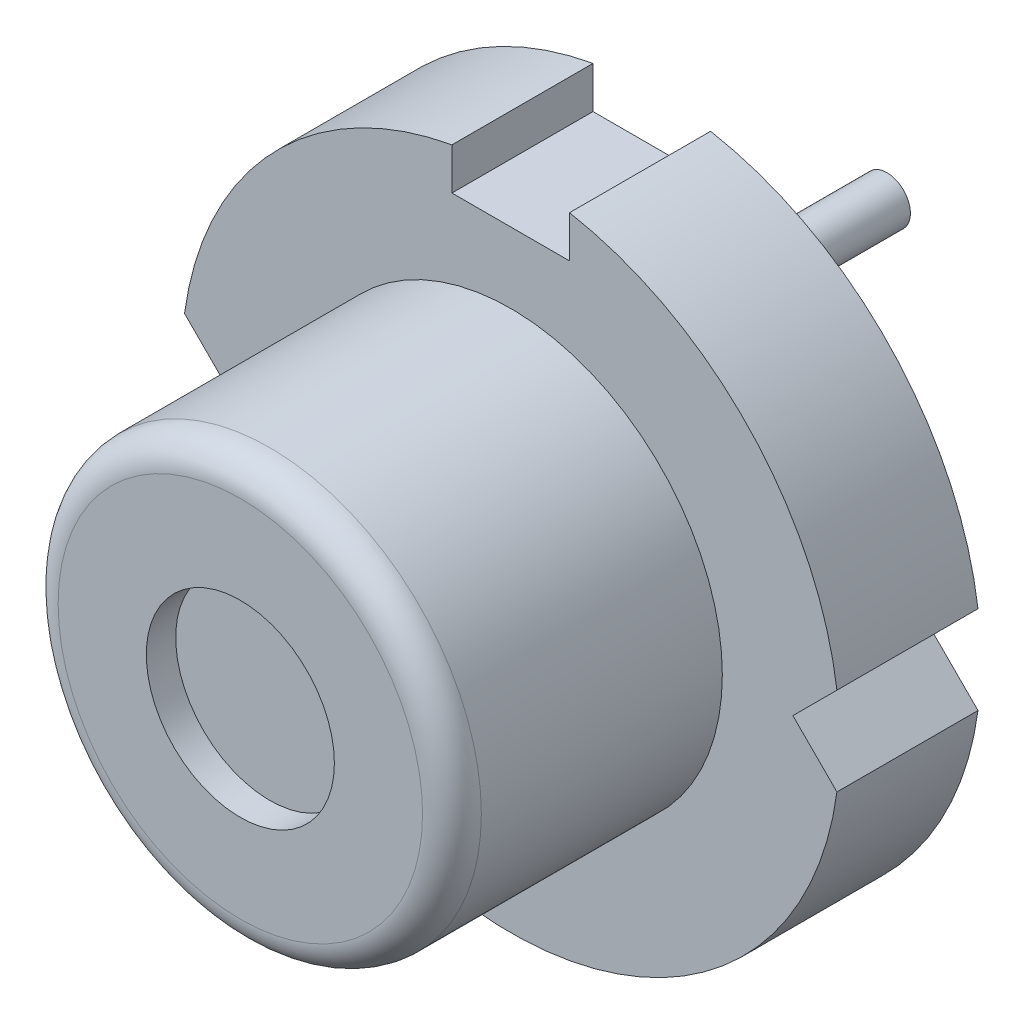
ISO-10303-21;
HEADER;
FILE_DESCRIPTION(('STEP AP214'),'2;1');
FILE_NAME('part.step','',(''),(''),'','','');
FILE_SCHEMA(('AUTOMOTIVE_DESIGN { 1 0 10303 214 1 1 1 1 }'));
ENDSEC;
DATA;
#1=APPLICATION_CONTEXT('core data for automotive mechanical design processes');
#2=APPLICATION_PROTOCOL_DEFINITION('international standard','automotive_design',2000,#1);
#3=PRODUCT_CONTEXT('',#1,'mechanical');
#4=PRODUCT('Part','Part','',(#3));
#5=PRODUCT_RELATED_PRODUCT_CATEGORY('part','',(#4));
#6=PRODUCT_DEFINITION_FORMATION('','',#4);
#7=PRODUCT_DEFINITION_CONTEXT('part definition',#1,'design');
#8=PRODUCT_DEFINITION('design','',#6,#7);
#9=PRODUCT_DEFINITION_SHAPE('','',#8);
#10=(LENGTH_UNIT() NAMED_UNIT(*) SI_UNIT(.MILLI.,.METRE.));
#11=(NAMED_UNIT(*) PLANE_ANGLE_UNIT() SI_UNIT($,.RADIAN.));
#12=(NAMED_UNIT(*) SI_UNIT($,.STERADIAN.) SOLID_ANGLE_UNIT());
#13=UNCERTAINTY_MEASURE_WITH_UNIT(LENGTH_MEASURE(1.E-05),#10,'distance_accuracy_value','');
#14=(GEOMETRIC_REPRESENTATION_CONTEXT(3) GLOBAL_UNCERTAINTY_ASSIGNED_CONTEXT((#13)) GLOBAL_UNIT_ASSIGNED_CONTEXT((#10,
#11,#12)) REPRESENTATION_CONTEXT('',''));
#15=CARTESIAN_POINT('',(0.,0.,0.));
#16=DIRECTION('',(0.,0.,1.));
#17=DIRECTION('',(1.,0.,0.));
#18=AXIS2_PLACEMENT_3D('',#15,#16,#17);
#19=CARTESIAN_POINT('',(0.,1.,0.25));
#20=DIRECTION('',(0.,0.,-1.));
#21=DIRECTION('',(-1.,0.,0.));
#22=AXIS2_PLACEMENT_3D('',#19,#20,#21);
#23=CYLINDRICAL_SURFACE('',#22,0.2);
#24=CARTESIAN_POINT('',(0.,1.,0.25));
#25=DIRECTION('',(0.,0.,-1.));
#26=DIRECTION('',(-1.,0.,0.));
#27=AXIS2_PLACEMENT_3D('',#24,#25,#26);
#28=CIRCLE('',#27,0.2);
#29=CARTESIAN_POINT('',(-0.2,1.,0.25));
#30=VERTEX_POINT('',#29);
#31=EDGE_CURVE('E11',#30,#30,#28,.T.);
#32=ORIENTED_EDGE('',*,*,#31,.T.);
#33=EDGE_LOOP('',(#32));
#34=FACE_BOUND('',#33,.T.);
#35=CARTESIAN_POINT('',(0.,1.,-2.));
#36=DIRECTION('',(0.,0.,-1.));
#37=DIRECTION('',(-1.,0.,0.));
#38=AXIS2_PLACEMENT_3D('',#35,#36,#37);
#39=CIRCLE('',#38,0.2);
#40=CARTESIAN_POINT('',(-0.2,1.,-2.));
#41=VERTEX_POINT('',#40);
#42=EDGE_CURVE('E47',#41,#41,#39,.T.);
#43=ORIENTED_EDGE('',*,*,#42,.F.);
#44=EDGE_LOOP('',(#43));
#45=FACE_BOUND('',#44,.T.);
#46=ADVANCED_FACE('F41',(#34,#45),#23,.T.);
#47=CARTESIAN_POINT('',(0.2,1.,0.25));
#48=DIRECTION('',(0.,0.,1.));
#49=DIRECTION('',(1.,0.,0.));
#50=AXIS2_PLACEMENT_3D('',#47,#48,#49);
#51=PLANE('',#50);
#52=ORIENTED_EDGE('',*,*,#31,.F.);
#53=EDGE_LOOP('',(#52));
#54=FACE_BOUND('',#53,.T.);
#55=ADVANCED_FACE('F56',(#54),#51,.T.);
#56=CARTESIAN_POINT('',(0.,1.,-2.));
#57=DIRECTION('',(0.,0.,-1.));
#58=DIRECTION('',(-1.,0.,0.));
#59=AXIS2_PLACEMENT_3D('',#56,#57,#58);
#60=PLANE('',#59);
#61=ORIENTED_EDGE('',*,*,#42,.T.);
#62=EDGE_LOOP('',(#61));
#63=FACE_BOUND('',#62,.T.);
#64=ADVANCED_FACE('F53',(#63),#60,.T.);
#65=CLOSED_SHELL('',(#46,#55,#64));
#66=MANIFOLD_SOLID_BREP('B2',#65);
#67=CARTESIAN_POINT('',(0.,-1.,0.25));
#68=DIRECTION('',(0.,0.,-1.));
#69=DIRECTION('',(-1.,0.,0.));
#70=AXIS2_PLACEMENT_3D('',#67,#68,#69);
#71=CYLINDRICAL_SURFACE('',#70,0.2);
#72=CARTESIAN_POINT('',(0.,-1.,0.25));
#73=DIRECTION('',(0.,0.,-1.));
#74=DIRECTION('',(-1.,0.,0.));
#75=AXIS2_PLACEMENT_3D('',#72,#73,#74);
#76=CIRCLE('',#75,0.2);
#77=CARTESIAN_POINT('',(-0.2,-1.,0.25));
#78=VERTEX_POINT('',#77);
#79=EDGE_CURVE('E40',#78,#78,#76,.T.);
#80=ORIENTED_EDGE('',*,*,#79,.T.);
#81=EDGE_LOOP('',(#80));
#82=FACE_BOUND('',#81,.T.);
#83=CARTESIAN_POINT('',(0.,-1.,-2.));
#84=DIRECTION('',(0.,0.,-1.));
#85=DIRECTION('',(-1.,0.,0.));
#86=AXIS2_PLACEMENT_3D('',#83,#84,#85);
#87=CIRCLE('',#86,0.2);
#88=CARTESIAN_POINT('',(-0.2,-1.,-2.));
#89=VERTEX_POINT('',#88);
#90=EDGE_CURVE('E96',#89,#89,#87,.T.);
#91=ORIENTED_EDGE('',*,*,#90,.F.);
#92=EDGE_LOOP('',(#91));
#93=FACE_BOUND('',#92,.T.);
#94=ADVANCED_FACE('F90',(#82,#93),#71,.T.);
#95=CARTESIAN_POINT('',(0.2,-1.,0.25));
#96=DIRECTION('',(0.,0.,1.));
#97=DIRECTION('',(1.,0.,0.));
#98=AXIS2_PLACEMENT_3D('',#95,#96,#97);
#99=PLANE('',#98);
#100=ORIENTED_EDGE('',*,*,#79,.F.);
#101=EDGE_LOOP('',(#100));
#102=FACE_BOUND('',#101,.T.);
#103=ADVANCED_FACE('F105',(#102),#99,.T.);
#104=CARTESIAN_POINT('',(0.,-1.,-2.));
#105=DIRECTION('',(0.,0.,-1.));
#106=DIRECTION('',(-1.,0.,0.));
#107=AXIS2_PLACEMENT_3D('',#104,#105,#106);
#108=PLANE('',#107);
#109=ORIENTED_EDGE('',*,*,#90,.T.);
#110=EDGE_LOOP('',(#109));
#111=FACE_BOUND('',#110,.T.);
#112=ADVANCED_FACE('F102',(#111),#108,.T.);
#113=CLOSED_SHELL('',(#94,#103,#112));
#114=MANIFOLD_SOLID_BREP('B6',#113);
#115=CARTESIAN_POINT('',(0.,0.,0.));
#116=DIRECTION('',(0.,0.,1.));
#117=DIRECTION('',(1.,0.,0.));
#118=AXIS2_PLACEMENT_3D('',#115,#116,#117);
#119=CYLINDRICAL_SURFACE('',#118,2.8);
#120=DIRECTION('',(0.,0.,1.));
#121=VECTOR('',#120,1.);
#122=CARTESIAN_POINT('',(0.5,2.75499546279118,0.));
#123=LINE('',#122,#121);
#124=CARTESIAN_POINT('',(0.5,2.75499546279118,0.));
#125=VERTEX_POINT('',#124);
#126=CARTESIAN_POINT('',(0.5,2.75499546279118,1.2));
#127=VERTEX_POINT('',#126);
#128=EDGE_CURVE('E318',#125,#127,#123,.T.);
#129=ORIENTED_EDGE('',*,*,#128,.T.);
#130=CARTESIAN_POINT('',(0.,0.,1.2));
#131=DIRECTION('',(0.,0.,1.));
#132=DIRECTION('',(1.,0.,0.));
#133=AXIS2_PLACEMENT_3D('',#130,#131,#132);
#134=CIRCLE('',#133,2.8);
#135=CARTESIAN_POINT('',(2.77480157480236,0.374801574802366,1.2));
#136=VERTEX_POINT('',#135);
#137=EDGE_CURVE('E237',#136,#127,#134,.T.);
#138=ORIENTED_EDGE('',*,*,#137,.F.);
#139=DIRECTION('',(0.,0.,1.));
#140=VECTOR('',#139,1.);
#141=CARTESIAN_POINT('',(2.77480157480236,0.374801574802366,0.));
#142=LINE('',#141,#140);
#143=CARTESIAN_POINT('',(2.77480157480236,0.374801574802366,0.));
#144=VERTEX_POINT('',#143);
#145=EDGE_CURVE('E291',#144,#136,#142,.T.);
#146=ORIENTED_EDGE('',*,*,#145,.F.);
#147=CARTESIAN_POINT('',(0.,0.,0.));
#148=DIRECTION('',(0.,0.,1.));
#149=DIRECTION('',(1.,0.,0.));
#150=AXIS2_PLACEMENT_3D('',#147,#148,#149);
#151=CIRCLE('',#150,2.8);
#152=EDGE_CURVE('E232',#144,#125,#151,.T.);
#153=ORIENTED_EDGE('',*,*,#152,.T.);
#154=EDGE_LOOP('',(#129,#138,#146,#153));
#155=FACE_BOUND('',#154,.T.);
#156=ADVANCED_FACE('F130',(#155),#119,.T.);
#157=DIRECTION('',(0.,0.,1.));
#158=VECTOR('',#157,1.);
#159=CARTESIAN_POINT('',(-0.5,2.75499546279118,0.));
#160=LINE('',#159,#158);
#161=CARTESIAN_POINT('',(-0.5,2.75499546279118,0.));
#162=VERTEX_POINT('',#161);
#163=CARTESIAN_POINT('',(-0.5,2.75499546279118,1.2));
#164=VERTEX_POINT('',#163);
#165=EDGE_CURVE('E145',#162,#164,#160,.T.);
#166=ORIENTED_EDGE('',*,*,#165,.F.);
#167=CARTESIAN_POINT('',(-2.77480157480236,0.374801574802365,0.));
#168=VERTEX_POINT('',#167);
#169=EDGE_CURVE('E221',#162,#168,#151,.T.);
#170=ORIENTED_EDGE('',*,*,#169,.T.);
#171=DIRECTION('',(0.,0.,1.));
#172=VECTOR('',#171,1.);
#173=CARTESIAN_POINT('',(-2.77480157480236,0.374801574802365,0.));
#174=LINE('',#173,#172);
#175=CARTESIAN_POINT('',(-2.77480157480236,0.374801574802365,1.2));
#176=VERTEX_POINT('',#175);
#177=EDGE_CURVE('E300',#168,#176,#174,.T.);
#178=ORIENTED_EDGE('',*,*,#177,.T.);
#179=EDGE_CURVE('E223',#164,#176,#134,.T.);
#180=ORIENTED_EDGE('',*,*,#179,.F.);
#181=EDGE_LOOP('',(#166,#170,#178,#180));
#182=FACE_BOUND('',#181,.T.);
#183=ADVANCED_FACE('F219',(#182),#119,.T.);
#184=DIRECTION('',(0.,0.,1.));
#185=VECTOR('',#184,1.);
#186=CARTESIAN_POINT('',(-2.77480157480236,-0.374801574802365,0.));
#187=LINE('',#186,#185);
#188=CARTESIAN_POINT('',(-2.77480157480236,-0.374801574802365,0.));
#189=VERTEX_POINT('',#188);
#190=CARTESIAN_POINT('',(-2.77480157480236,-0.374801574802365,1.2));
#191=VERTEX_POINT('',#190);
#192=EDGE_CURVE('E153',#189,#191,#187,.T.);
#193=ORIENTED_EDGE('',*,*,#192,.F.);
#194=CARTESIAN_POINT('',(2.77480157480236,-0.374801574802364,0.));
#195=VERTEX_POINT('',#194);
#196=EDGE_CURVE('E233',#189,#195,#151,.T.);
#197=ORIENTED_EDGE('',*,*,#196,.T.);
#198=DIRECTION('',(0.,0.,1.));
#199=VECTOR('',#198,1.);
#200=CARTESIAN_POINT('',(2.77480157480236,-0.374801574802364,0.));
#201=LINE('',#200,#199);
#202=CARTESIAN_POINT('',(2.77480157480236,-0.374801574802364,1.2));
#203=VERTEX_POINT('',#202);
#204=EDGE_CURVE('E303',#195,#203,#201,.T.);
#205=ORIENTED_EDGE('',*,*,#204,.T.);
#206=EDGE_CURVE('E280',#191,#203,#134,.T.);
#207=ORIENTED_EDGE('',*,*,#206,.F.);
#208=EDGE_LOOP('',(#193,#197,#205,#207));
#209=FACE_BOUND('',#208,.T.);
#210=ADVANCED_FACE('F263',(#209),#119,.T.);
#211=CARTESIAN_POINT('',(2.8,0.,0.));
#212=DIRECTION('',(0.,0.,-1.));
#213=DIRECTION('',(-1.,0.,0.));
#214=AXIS2_PLACEMENT_3D('',#211,#212,#213);
#215=PLANE('',#214);
#216=CARTESIAN_POINT('',(-1.,0.,0.));
#217=DIRECTION('',(0.,0.,-1.));
#218=DIRECTION('',(-1.,0.,0.));
#219=AXIS2_PLACEMENT_3D('',#216,#217,#218);
#220=CIRCLE('',#219,0.2);
#221=CARTESIAN_POINT('',(-1.2,0.,0.));
#222=VERTEX_POINT('',#221);
#223=EDGE_CURVE('E243',#222,#222,#220,.T.);
#224=ORIENTED_EDGE('',*,*,#223,.F.);
#225=EDGE_LOOP('',(#224));
#226=FACE_BOUND('',#225,.T.);
#227=CARTESIAN_POINT('',(0.,-1.,0.));
#228=DIRECTION('',(0.,0.,-1.));
#229=DIRECTION('',(-1.,0.,0.));
#230=AXIS2_PLACEMENT_3D('',#227,#228,#229);
#231=CIRCLE('',#230,0.449999999999987);
#232=CARTESIAN_POINT('',(-0.449999999999987,-1.,0.));
#233=VERTEX_POINT('',#232);
#234=EDGE_CURVE('E354',#233,#233,#231,.T.);
#235=ORIENTED_EDGE('',*,*,#234,.F.);
#236=EDGE_LOOP('',(#235));
#237=FACE_BOUND('',#236,.T.);
#238=CARTESIAN_POINT('',(0.,1.,0.));
#239=DIRECTION('',(0.,0.,-1.));
#240=DIRECTION('',(-1.,0.,0.));
#241=AXIS2_PLACEMENT_3D('',#238,#239,#240);
#242=CIRCLE('',#241,0.449999999999987);
#243=CARTESIAN_POINT('',(-0.449999999999987,1.,0.));
#244=VERTEX_POINT('',#243);
#245=EDGE_CURVE('E344',#244,#244,#242,.T.);
#246=ORIENTED_EDGE('',*,*,#245,.F.);
#247=EDGE_LOOP('',(#246));
#248=FACE_BOUND('',#247,.T.);
#249=DIRECTION('',(0.,1.,0.));
#250=VECTOR('',#249,1.);
#251=CARTESIAN_POINT('',(0.5,2.4,0.));
#252=LINE('',#251,#250);
#253=CARTESIAN_POINT('',(0.5,2.4,0.));
#254=VERTEX_POINT('',#253);
#255=EDGE_CURVE('E224',#254,#125,#252,.T.);
#256=ORIENTED_EDGE('',*,*,#255,.T.);
#257=ORIENTED_EDGE('',*,*,#152,.F.);
#258=DIRECTION('',(-0.707106781186544,-0.707106781186551,0.));
#259=VECTOR('',#258,1.);
#260=CARTESIAN_POINT('',(2.77480157480236,0.374801574802366,0.));
#261=LINE('',#260,#259);
#262=CARTESIAN_POINT('',(2.4,0.,0.));
#263=VERTEX_POINT('',#262);
#264=EDGE_CURVE('E289',#144,#263,#261,.T.);
#265=ORIENTED_EDGE('',*,*,#264,.T.);
#266=DIRECTION('',(0.707106781186546,-0.707106781186549,0.));
#267=VECTOR('',#266,1.);
#268=CARTESIAN_POINT('',(2.4,0.,0.));
#269=LINE('',#268,#267);
#270=EDGE_CURVE('E287',#263,#195,#269,.T.);
#271=ORIENTED_EDGE('',*,*,#270,.T.);
#272=ORIENTED_EDGE('',*,*,#196,.F.);
#273=DIRECTION('',(0.707106781186545,0.70710678118655,0.));
#274=VECTOR('',#273,1.);
#275=CARTESIAN_POINT('',(-2.77480157480236,-0.374801574802365,0.));
#276=LINE('',#275,#274);
#277=CARTESIAN_POINT('',(-2.4,0.,0.));
#278=VERTEX_POINT('',#277);
#279=EDGE_CURVE('E284',#189,#278,#276,.T.);
#280=ORIENTED_EDGE('',*,*,#279,.T.);
#281=DIRECTION('',(-0.707106781186545,0.70710678118655,0.));
#282=VECTOR('',#281,1.);
#283=CARTESIAN_POINT('',(-2.4,0.,0.));
#284=LINE('',#283,#282);
#285=EDGE_CURVE('E231',#278,#168,#284,.T.);
#286=ORIENTED_EDGE('',*,*,#285,.T.);
#287=ORIENTED_EDGE('',*,*,#169,.F.);
#288=DIRECTION('',(0.,-1.,0.));
#289=VECTOR('',#288,1.);
#290=CARTESIAN_POINT('',(-0.5,2.75499546279118,0.));
#291=LINE('',#290,#289);
#292=CARTESIAN_POINT('',(-0.5,2.4,0.));
#293=VERTEX_POINT('',#292);
#294=EDGE_CURVE('E207',#162,#293,#291,.T.);
#295=ORIENTED_EDGE('',*,*,#294,.T.);
#296=DIRECTION('',(1.,0.,0.));
#297=VECTOR('',#296,1.);
#298=CARTESIAN_POINT('',(-0.5,2.4,0.));
#299=LINE('',#298,#297);
#300=EDGE_CURVE('E214',#293,#254,#299,.T.);
#301=ORIENTED_EDGE('',*,*,#300,.T.);
#302=EDGE_LOOP('',(#256,#257,#265,#271,#272,#280,#286,#287,#295,#301));
#303=FACE_BOUND('',#302,.T.);
#304=ADVANCED_FACE('F228',(#226,#237,#248,#303),#215,.T.);
#305=CARTESIAN_POINT('',(0.,0.,1.2));
#306=DIRECTION('',(0.,0.,1.));
#307=DIRECTION('',(1.,0.,0.));
#308=AXIS2_PLACEMENT_3D('',#305,#306,#307);
#309=PLANE('',#308);
#310=CARTESIAN_POINT('',(0.,0.,1.2));
#311=DIRECTION('',(0.,0.,1.));
#312=DIRECTION('',(1.,0.,0.));
#313=AXIS2_PLACEMENT_3D('',#310,#311,#312);
#314=CIRCLE('',#313,1.8);
#315=CARTESIAN_POINT('',(1.8,0.,1.2));
#316=VERTEX_POINT('',#315);
#317=EDGE_CURVE('E236',#316,#316,#314,.T.);
#318=ORIENTED_EDGE('',*,*,#317,.F.);
#319=EDGE_LOOP('',(#318));
#320=FACE_BOUND('',#319,.T.);
#321=DIRECTION('',(0.,1.,0.));
#322=VECTOR('',#321,1.);
#323=CARTESIAN_POINT('',(0.5,2.4,1.2));
#324=LINE('',#323,#322);
#325=CARTESIAN_POINT('',(0.5,2.4,1.2));
#326=VERTEX_POINT('',#325);
#327=EDGE_CURVE('E215',#326,#127,#324,.T.);
#328=ORIENTED_EDGE('',*,*,#327,.F.);
#329=DIRECTION('',(1.,0.,0.));
#330=VECTOR('',#329,1.);
#331=CARTESIAN_POINT('',(-0.5,2.4,1.2));
#332=LINE('',#331,#330);
#333=CARTESIAN_POINT('',(-0.5,2.4,1.2));
#334=VERTEX_POINT('',#333);
#335=EDGE_CURVE('E340',#334,#326,#332,.T.);
#336=ORIENTED_EDGE('',*,*,#335,.F.);
#337=DIRECTION('',(0.,-1.,0.));
#338=VECTOR('',#337,1.);
#339=CARTESIAN_POINT('',(-0.5,2.75499546279118,1.2));
#340=LINE('',#339,#338);
#341=EDGE_CURVE('E338',#164,#334,#340,.T.);
#342=ORIENTED_EDGE('',*,*,#341,.F.);
#343=ORIENTED_EDGE('',*,*,#179,.T.);
#344=DIRECTION('',(-0.707106781186545,0.70710678118655,0.));
#345=VECTOR('',#344,1.);
#346=CARTESIAN_POINT('',(-2.4,0.,1.2));
#347=LINE('',#346,#345);
#348=CARTESIAN_POINT('',(-2.4,0.,1.2));
#349=VERTEX_POINT('',#348);
#350=EDGE_CURVE('E323',#349,#176,#347,.T.);
#351=ORIENTED_EDGE('',*,*,#350,.F.);
#352=DIRECTION('',(0.707106781186545,0.70710678118655,0.));
#353=VECTOR('',#352,1.);
#354=CARTESIAN_POINT('',(-2.77480157480236,-0.374801574802365,1.2));
#355=LINE('',#354,#353);
#356=EDGE_CURVE('E316',#191,#349,#355,.T.);
#357=ORIENTED_EDGE('',*,*,#356,.F.);
#358=ORIENTED_EDGE('',*,*,#206,.T.);
#359=DIRECTION('',(0.707106781186546,-0.707106781186549,0.));
#360=VECTOR('',#359,1.);
#361=CARTESIAN_POINT('',(2.4,0.,1.2));
#362=LINE('',#361,#360);
#363=CARTESIAN_POINT('',(2.4,0.,1.2));
#364=VERTEX_POINT('',#363);
#365=EDGE_CURVE('E294',#364,#203,#362,.T.);
#366=ORIENTED_EDGE('',*,*,#365,.F.);
#367=DIRECTION('',(-0.707106781186544,-0.707106781186551,0.));
#368=VECTOR('',#367,1.);
#369=CARTESIAN_POINT('',(2.77480157480236,0.374801574802366,1.2));
#370=LINE('',#369,#368);
#371=EDGE_CURVE('E297',#136,#364,#370,.T.);
#372=ORIENTED_EDGE('',*,*,#371,.F.);
#373=ORIENTED_EDGE('',*,*,#137,.T.);
#374=EDGE_LOOP('',(#328,#336,#342,#343,#351,#357,#358,#366,#372,#373));
#375=FACE_BOUND('',#374,.T.);
#376=ADVANCED_FACE('F274',(#320,#375),#309,.T.);
#377=CARTESIAN_POINT('',(2.4,0.,0.));
#378=DIRECTION('',(-0.707106781186549,-0.707106781186546,0.));
#379=DIRECTION('',(0.707106781186546,-0.707106781186549,0.));
#380=AXIS2_PLACEMENT_3D('',#377,#378,#379);
#381=PLANE('',#380);
#382=ORIENTED_EDGE('',*,*,#365,.T.);
#383=ORIENTED_EDGE('',*,*,#204,.F.);
#384=ORIENTED_EDGE('',*,*,#270,.F.);
#385=DIRECTION('',(0.,0.,1.));
#386=VECTOR('',#385,1.);
#387=CARTESIAN_POINT('',(2.4,0.,0.));
#388=LINE('',#387,#386);
#389=EDGE_CURVE('E293',#263,#364,#388,.T.);
#390=ORIENTED_EDGE('',*,*,#389,.T.);
#391=EDGE_LOOP('',(#382,#383,#384,#390));
#392=FACE_BOUND('',#391,.T.);
#393=ADVANCED_FACE('F305',(#392),#381,.F.);
#394=CARTESIAN_POINT('',(2.77480157480236,0.374801574802366,0.));
#395=DIRECTION('',(-0.707106781186551,0.707106781186544,0.));
#396=DIRECTION('',(-0.707106781186544,-0.707106781186551,0.));
#397=AXIS2_PLACEMENT_3D('',#394,#395,#396);
#398=PLANE('',#397);
#399=ORIENTED_EDGE('',*,*,#371,.T.);
#400=ORIENTED_EDGE('',*,*,#389,.F.);
#401=ORIENTED_EDGE('',*,*,#264,.F.);
#402=ORIENTED_EDGE('',*,*,#145,.T.);
#403=EDGE_LOOP('',(#399,#400,#401,#402));
#404=FACE_BOUND('',#403,.T.);
#405=ADVANCED_FACE('F309',(#404),#398,.F.);
#406=CARTESIAN_POINT('',(-2.4,0.,0.));
#407=DIRECTION('',(0.70710678118655,0.707106781186545,0.));
#408=DIRECTION('',(-0.707106781186545,0.70710678118655,0.));
#409=AXIS2_PLACEMENT_3D('',#406,#407,#408);
#410=PLANE('',#409);
#411=ORIENTED_EDGE('',*,*,#350,.T.);
#412=ORIENTED_EDGE('',*,*,#177,.F.);
#413=ORIENTED_EDGE('',*,*,#285,.F.);
#414=DIRECTION('',(0.,0.,1.));
#415=VECTOR('',#414,1.);
#416=CARTESIAN_POINT('',(-2.4,0.,0.));
#417=LINE('',#416,#415);
#418=EDGE_CURVE('E281',#278,#349,#417,.T.);
#419=ORIENTED_EDGE('',*,*,#418,.T.);
#420=EDGE_LOOP('',(#411,#412,#413,#419));
#421=FACE_BOUND('',#420,.T.);
#422=ADVANCED_FACE('F336',(#421),#410,.F.);
#423=CARTESIAN_POINT('',(-2.77480157480236,-0.374801574802365,0.));
#424=DIRECTION('',(0.70710678118655,-0.707106781186545,0.));
#425=DIRECTION('',(0.707106781186545,0.70710678118655,0.));
#426=AXIS2_PLACEMENT_3D('',#423,#424,#425);
#427=PLANE('',#426);
#428=ORIENTED_EDGE('',*,*,#356,.T.);
#429=ORIENTED_EDGE('',*,*,#418,.F.);
#430=ORIENTED_EDGE('',*,*,#279,.F.);
#431=ORIENTED_EDGE('',*,*,#192,.T.);
#432=EDGE_LOOP('',(#428,#429,#430,#431));
#433=FACE_BOUND('',#432,.T.);
#434=ADVANCED_FACE('F337',(#433),#427,.F.);
#435=CARTESIAN_POINT('',(0.5,2.4,0.));
#436=DIRECTION('',(1.,0.,0.));
#437=DIRECTION('',(0.,1.,0.));
#438=AXIS2_PLACEMENT_3D('',#435,#436,#437);
#439=PLANE('',#438);
#440=ORIENTED_EDGE('',*,*,#327,.T.);
#441=ORIENTED_EDGE('',*,*,#128,.F.);
#442=ORIENTED_EDGE('',*,*,#255,.F.);
#443=DIRECTION('',(0.,0.,1.));
#444=VECTOR('',#443,1.);
#445=CARTESIAN_POINT('',(0.5,2.4,0.));
#446=LINE('',#445,#444);
#447=EDGE_CURVE('E321',#254,#326,#446,.T.);
#448=ORIENTED_EDGE('',*,*,#447,.T.);
#449=EDGE_LOOP('',(#440,#441,#442,#448));
#450=FACE_BOUND('',#449,.T.);
#451=ADVANCED_FACE('F395',(#450),#439,.F.);
#452=CARTESIAN_POINT('',(-0.5,2.4,0.));
#453=DIRECTION('',(0.,-1.,0.));
#454=DIRECTION('',(0.,0.,-1.));
#455=AXIS2_PLACEMENT_3D('',#452,#453,#454);
#456=PLANE('',#455);
#457=ORIENTED_EDGE('',*,*,#335,.T.);
#458=ORIENTED_EDGE('',*,*,#447,.F.);
#459=ORIENTED_EDGE('',*,*,#300,.F.);
#460=DIRECTION('',(0.,0.,1.));
#461=VECTOR('',#460,1.);
#462=CARTESIAN_POINT('',(-0.5,2.4,0.));
#463=LINE('',#462,#461);
#464=EDGE_CURVE('E209',#293,#334,#463,.T.);
#465=ORIENTED_EDGE('',*,*,#464,.T.);
#466=EDGE_LOOP('',(#457,#458,#459,#465));
#467=FACE_BOUND('',#466,.T.);
#468=ADVANCED_FACE('F398',(#467),#456,.F.);
#469=CARTESIAN_POINT('',(-0.5,2.75499546279118,0.));
#470=DIRECTION('',(-1.,0.,0.));
#471=DIRECTION('',(0.,-1.,0.));
#472=AXIS2_PLACEMENT_3D('',#469,#470,#471);
#473=PLANE('',#472);
#474=ORIENTED_EDGE('',*,*,#341,.T.);
#475=ORIENTED_EDGE('',*,*,#464,.F.);
#476=ORIENTED_EDGE('',*,*,#294,.F.);
#477=ORIENTED_EDGE('',*,*,#165,.T.);
#478=EDGE_LOOP('',(#474,#475,#476,#477));
#479=FACE_BOUND('',#478,.T.);
#480=ADVANCED_FACE('F208',(#479),#473,.F.);
#481=CARTESIAN_POINT('',(0.,1.,0.));
#482=DIRECTION('',(0.,0.,-1.));
#483=DIRECTION('',(-1.,0.,0.));
#484=AXIS2_PLACEMENT_3D('',#481,#482,#483);
#485=CYLINDRICAL_SURFACE('',#484,0.449999999999987);
#486=CARTESIAN_POINT('',(0.,1.,1.20000000000001));
#487=DIRECTION('',(0.,0.,-1.));
#488=DIRECTION('',(-1.,0.,0.));
#489=AXIS2_PLACEMENT_3D('',#486,#487,#488);
#490=CIRCLE('',#489,0.449999999999987);
#491=CARTESIAN_POINT('',(-0.449999999999987,1.,1.20000000000001));
#492=VERTEX_POINT('',#491);
#493=EDGE_CURVE('E341',#492,#492,#490,.T.);
#494=ORIENTED_EDGE('',*,*,#493,.F.);
#495=EDGE_LOOP('',(#494));
#496=FACE_BOUND('',#495,.T.);
#497=ORIENTED_EDGE('',*,*,#245,.T.);
#498=EDGE_LOOP('',(#497));
#499=FACE_BOUND('',#498,.T.);
#500=ADVANCED_FACE('F390',(#496,#499),#485,.F.);
#501=CARTESIAN_POINT('',(0.,-1.,0.));
#502=DIRECTION('',(0.,0.,-1.));
#503=DIRECTION('',(-1.,0.,0.));
#504=AXIS2_PLACEMENT_3D('',#501,#502,#503);
#505=CYLINDRICAL_SURFACE('',#504,0.449999999999987);
#506=CARTESIAN_POINT('',(0.,-1.,1.20000000000001));
#507=DIRECTION('',(0.,0.,-1.));
#508=DIRECTION('',(-1.,0.,0.));
#509=AXIS2_PLACEMENT_3D('',#506,#507,#508);
#510=CIRCLE('',#509,0.449999999999987);
#511=CARTESIAN_POINT('',(-0.449999999999987,-1.,1.20000000000001));
#512=VERTEX_POINT('',#511);
#513=EDGE_CURVE('E351',#512,#512,#510,.T.);
#514=ORIENTED_EDGE('',*,*,#513,.F.);
#515=EDGE_LOOP('',(#514));
#516=FACE_BOUND('',#515,.T.);
#517=ORIENTED_EDGE('',*,*,#234,.T.);
#518=EDGE_LOOP('',(#517));
#519=FACE_BOUND('',#518,.T.);
#520=ADVANCED_FACE('F387',(#516,#519),#505,.F.);
#521=CARTESIAN_POINT('',(1.8,0.,1.2));
#522=DIRECTION('',(0.,0.,-1.));
#523=DIRECTION('',(-1.,0.,0.));
#524=AXIS2_PLACEMENT_3D('',#521,#522,#523);
#525=PLANE('',#524);
#526=ORIENTED_EDGE('',*,*,#513,.T.);
#527=EDGE_LOOP('',(#526));
#528=FACE_BOUND('',#527,.T.);
#529=ADVANCED_FACE('F384',(#528),#525,.T.);
#530=ORIENTED_EDGE('',*,*,#493,.T.);
#531=EDGE_LOOP('',(#530));
#532=FACE_BOUND('',#531,.T.);
#533=ADVANCED_FACE('F378',(#532),#525,.T.);
#534=CARTESIAN_POINT('',(0.,0.,1.2));
#535=DIRECTION('',(0.,0.,1.));
#536=DIRECTION('',(1.,0.,0.));
#537=AXIS2_PLACEMENT_3D('',#534,#535,#536);
#538=CYLINDRICAL_SURFACE('',#537,1.8);
#539=CARTESIAN_POINT('',(0.,0.,3.25));
#540=DIRECTION('',(0.,0.,1.));
#541=DIRECTION('',(1.,0.,0.));
#542=AXIS2_PLACEMENT_3D('',#539,#540,#541);
#543=CIRCLE('',#542,1.8);
#544=CARTESIAN_POINT('',(1.8,0.,3.25));
#545=VERTEX_POINT('',#544);
#546=EDGE_CURVE('E88',#545,#545,#543,.F.);
#547=ORIENTED_EDGE('',*,*,#546,.T.);
#548=EDGE_LOOP('',(#547));
#549=FACE_BOUND('',#548,.T.);
#550=ORIENTED_EDGE('',*,*,#317,.T.);
#551=EDGE_LOOP('',(#550));
#552=FACE_BOUND('',#551,.T.);
#553=ADVANCED_FACE('F369',(#549,#552),#538,.T.);
#554=CARTESIAN_POINT('',(0.,0.,3.5));
#555=DIRECTION('',(0.,0.,1.));
#556=DIRECTION('',(1.,0.,0.));
#557=AXIS2_PLACEMENT_3D('',#554,#555,#556);
#558=PLANE('',#557);
#559=CARTESIAN_POINT('',(0.,0.,3.5));
#560=DIRECTION('',(0.,0.,1.));
#561=DIRECTION('',(1.,0.,0.));
#562=AXIS2_PLACEMENT_3D('',#559,#560,#561);
#563=CIRCLE('',#562,1.55);
#564=CARTESIAN_POINT('',(1.55,0.,3.5));
#565=VERTEX_POINT('',#564);
#566=EDGE_CURVE('E138',#565,#565,#563,.T.);
#567=ORIENTED_EDGE('',*,*,#566,.T.);
#568=EDGE_LOOP('',(#567));
#569=FACE_BOUND('',#568,.T.);
#570=CARTESIAN_POINT('',(0.,0.,3.5));
#571=DIRECTION('',(0.,0.,1.));
#572=DIRECTION('',(1.,0.,0.));
#573=AXIS2_PLACEMENT_3D('',#570,#571,#572);
#574=CIRCLE('',#573,0.79999999999999);
#575=CARTESIAN_POINT('',(0.79999999999999,0.,3.5));
#576=VERTEX_POINT('',#575);
#577=EDGE_CURVE('E363',#576,#576,#574,.T.);
#578=ORIENTED_EDGE('',*,*,#577,.F.);
#579=EDGE_LOOP('',(#578));
#580=FACE_BOUND('',#579,.T.);
#581=ADVANCED_FACE('F248',(#569,#580),#558,.T.);
#582=CARTESIAN_POINT('',(-1.,0.,0.));
#583=DIRECTION('',(0.,0.,-1.));
#584=DIRECTION('',(-1.,0.,0.));
#585=AXIS2_PLACEMENT_3D('',#582,#583,#584);
#586=CYLINDRICAL_SURFACE('',#585,0.2);
#587=ORIENTED_EDGE('',*,*,#223,.T.);
#588=EDGE_LOOP('',(#587));
#589=FACE_BOUND('',#588,.T.);
#590=CARTESIAN_POINT('',(-1.,0.,-2.));
#591=DIRECTION('',(0.,0.,-1.));
#592=DIRECTION('',(-1.,0.,0.));
#593=AXIS2_PLACEMENT_3D('',#590,#591,#592);
#594=CIRCLE('',#593,0.2);
#595=CARTESIAN_POINT('',(-1.2,0.,-2.));
#596=VERTEX_POINT('',#595);
#597=EDGE_CURVE('E357',#596,#596,#594,.T.);
#598=ORIENTED_EDGE('',*,*,#597,.F.);
#599=EDGE_LOOP('',(#598));
#600=FACE_BOUND('',#599,.T.);
#601=ADVANCED_FACE('F368',(#589,#600),#586,.T.);
#602=CARTESIAN_POINT('',(-1.,0.,-2.));
#603=DIRECTION('',(0.,0.,-1.));
#604=DIRECTION('',(-1.,0.,0.));
#605=AXIS2_PLACEMENT_3D('',#602,#603,#604);
#606=PLANE('',#605);
#607=ORIENTED_EDGE('',*,*,#597,.T.);
#608=EDGE_LOOP('',(#607));
#609=FACE_BOUND('',#608,.T.);
#610=ADVANCED_FACE('F375',(#609),#606,.T.);
#611=CARTESIAN_POINT('',(0.,0.,3.25));
#612=DIRECTION('',(0.,0.,-1.));
#613=DIRECTION('',(-1.,0.,0.));
#614=AXIS2_PLACEMENT_3D('',#611,#612,#613);
#615=PLANE('',#614);
#616=CARTESIAN_POINT('',(0.,0.,3.25));
#617=DIRECTION('',(0.,0.,1.));
#618=DIRECTION('',(1.,0.,0.));
#619=AXIS2_PLACEMENT_3D('',#616,#617,#618);
#620=CIRCLE('',#619,0.79999999999999);
#621=CARTESIAN_POINT('',(0.79999999999999,0.,3.25));
#622=VERTEX_POINT('',#621);
#623=EDGE_CURVE('E360',#622,#622,#620,.T.);
#624=ORIENTED_EDGE('',*,*,#623,.T.);
#625=EDGE_LOOP('',(#624));
#626=FACE_BOUND('',#625,.T.);
#627=ADVANCED_FACE('F257',(#626),#615,.F.);
#628=CARTESIAN_POINT('',(0.,0.,3.5));
#629=DIRECTION('',(0.,0.,1.));
#630=DIRECTION('',(1.,0.,0.));
#631=AXIS2_PLACEMENT_3D('',#628,#629,#630);
#632=CYLINDRICAL_SURFACE('',#631,0.79999999999999);
#633=ORIENTED_EDGE('',*,*,#623,.F.);
#634=EDGE_LOOP('',(#633));
#635=FACE_BOUND('',#634,.T.);
#636=ORIENTED_EDGE('',*,*,#577,.T.);
#637=EDGE_LOOP('',(#636));
#638=FACE_BOUND('',#637,.T.);
#639=ADVANCED_FACE('F252',(#635,#638),#632,.F.);
#640=CARTESIAN_POINT('',(0.,0.,3.25));
#641=DIRECTION('',(0.,0.,1.));
#642=DIRECTION('',(1.,0.,0.));
#643=AXIS2_PLACEMENT_3D('',#640,#641,#642);
#644=TOROIDAL_SURFACE('',#643,1.55,0.25);
#645=ORIENTED_EDGE('',*,*,#546,.F.);
#646=EDGE_LOOP('',(#645));
#647=FACE_BOUND('',#646,.T.);
#648=ORIENTED_EDGE('',*,*,#566,.F.);
#649=EDGE_LOOP('',(#648));
#650=FACE_BOUND('',#649,.T.);
#651=ADVANCED_FACE('F132',(#647,#650),#644,.T.);
#652=CLOSED_SHELL('',(#156,#183,#210,#304,#376,#393,#405,#422,#434,#451,#468,#480,#500,#520,
#529,#533,#553,#581,#601,#610,#627,#639,#651));
#653=MANIFOLD_SOLID_BREP('B35',#652);
#654=ADVANCED_BREP_SHAPE_REPRESENTATION('',(#18,#66,#114,#653),#14);
#655=SHAPE_DEFINITION_REPRESENTATION(#9,#654);
ENDSEC;
END-ISO-10303-21;
